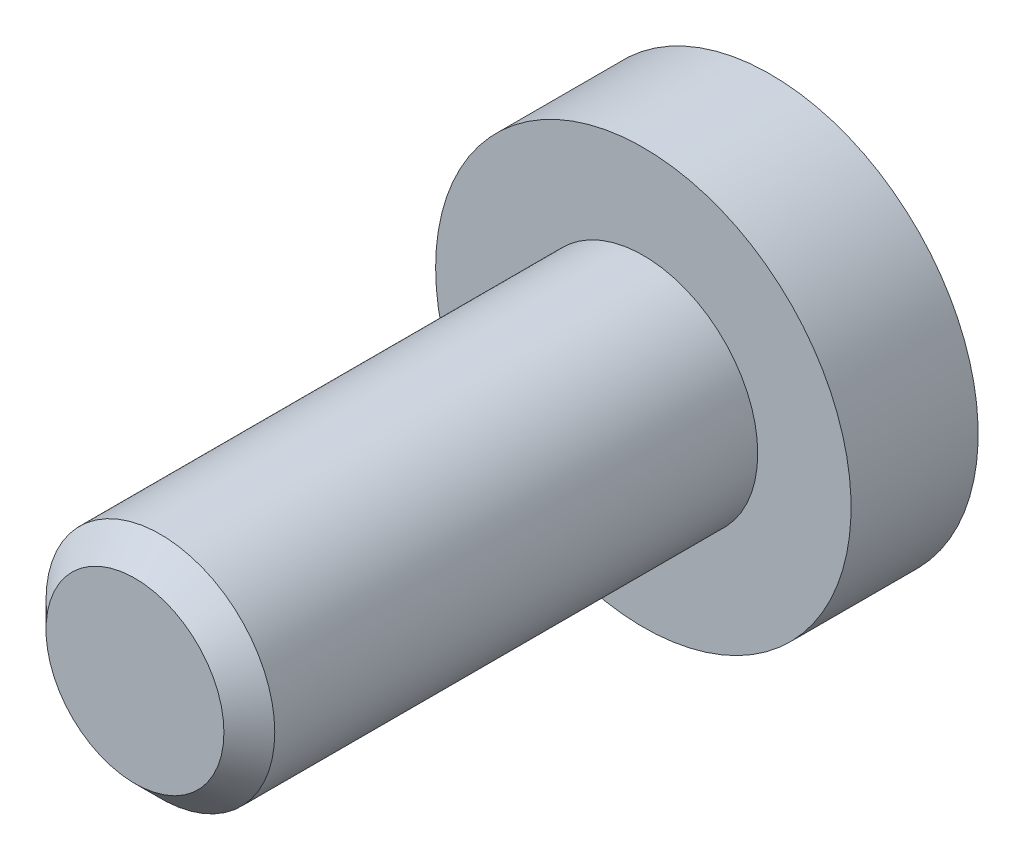
ISO-10303-21;
HEADER;
FILE_DESCRIPTION(('STEP AP214'),'2;1');
FILE_NAME('part.step','',(''),(''),'','','');
FILE_SCHEMA(('AUTOMOTIVE_DESIGN { 1 0 10303 214 1 1 1 1 }'));
ENDSEC;
DATA;
#1=APPLICATION_CONTEXT('core data for automotive mechanical design processes');
#2=APPLICATION_PROTOCOL_DEFINITION('international standard','automotive_design',2000,#1);
#3=PRODUCT_CONTEXT('',#1,'mechanical');
#4=PRODUCT('Part','Part','',(#3));
#5=PRODUCT_RELATED_PRODUCT_CATEGORY('part','',(#4));
#6=PRODUCT_DEFINITION_FORMATION('','',#4);
#7=PRODUCT_DEFINITION_CONTEXT('part definition',#1,'design');
#8=PRODUCT_DEFINITION('design','',#6,#7);
#9=PRODUCT_DEFINITION_SHAPE('','',#8);
#10=(LENGTH_UNIT() NAMED_UNIT(*) SI_UNIT(.MILLI.,.METRE.));
#11=(NAMED_UNIT(*) PLANE_ANGLE_UNIT() SI_UNIT($,.RADIAN.));
#12=(NAMED_UNIT(*) SI_UNIT($,.STERADIAN.) SOLID_ANGLE_UNIT());
#13=UNCERTAINTY_MEASURE_WITH_UNIT(LENGTH_MEASURE(1.E-05),#10,'distance_accuracy_value','');
#14=(GEOMETRIC_REPRESENTATION_CONTEXT(3) GLOBAL_UNCERTAINTY_ASSIGNED_CONTEXT((#13)) GLOBAL_UNIT_ASSIGNED_CONTEXT((#10,
#11,#12)) REPRESENTATION_CONTEXT('',''));
#15=CARTESIAN_POINT('',(0.,0.,0.));
#16=DIRECTION('',(0.,0.,1.));
#17=DIRECTION('',(1.,0.,0.));
#18=AXIS2_PLACEMENT_3D('',#15,#16,#17);
#19=CARTESIAN_POINT('',(0.,0.,10.));
#20=DIRECTION('',(0.,0.,-1.));
#21=DIRECTION('',(-1.,0.,0.));
#22=AXIS2_PLACEMENT_3D('',#19,#20,#21);
#23=PLANE('',#22);
#24=CARTESIAN_POINT('',(0.,0.,10.));
#25=DIRECTION('',(0.,0.,-1.));
#26=DIRECTION('',(-1.,0.,0.));
#27=AXIS2_PLACEMENT_3D('',#24,#25,#26);
#28=CIRCLE('',#27,16.3440730834026);
#29=CARTESIAN_POINT('',(-16.3440730834026,0.,10.));
#30=VERTEX_POINT('',#29);
#31=EDGE_CURVE('E46',#30,#30,#28,.T.);
#32=ORIENTED_EDGE('',*,*,#31,.F.);
#33=EDGE_LOOP('',(#32));
#34=FACE_BOUND('',#33,.T.);
#35=CARTESIAN_POINT('',(0.,0.,10.));
#36=DIRECTION('',(0.,0.,-1.));
#37=DIRECTION('',(-1.,0.,0.));
#38=AXIS2_PLACEMENT_3D('',#35,#36,#37);
#39=CIRCLE('',#38,9.);
#40=CARTESIAN_POINT('',(9.,0.,10.));
#41=VERTEX_POINT('',#40);
#42=EDGE_CURVE('E55',#41,#41,#39,.F.);
#43=ORIENTED_EDGE('',*,*,#42,.F.);
#44=EDGE_LOOP('',(#43));
#45=FACE_BOUND('',#44,.T.);
#46=ADVANCED_FACE('F38',(#34,#45),#23,.F.);
#47=CARTESIAN_POINT('',(0.,0.,10.));
#48=DIRECTION('',(0.,0.,-1.));
#49=DIRECTION('',(-1.,0.,0.));
#50=AXIS2_PLACEMENT_3D('',#47,#48,#49);
#51=CYLINDRICAL_SURFACE('',#50,16.3440730834026);
#52=ORIENTED_EDGE('',*,*,#31,.T.);
#53=EDGE_LOOP('',(#52));
#54=FACE_BOUND('',#53,.T.);
#55=CARTESIAN_POINT('',(0.,0.,0.));
#56=DIRECTION('',(0.,0.,-1.));
#57=DIRECTION('',(-1.,0.,0.));
#58=AXIS2_PLACEMENT_3D('',#55,#56,#57);
#59=CIRCLE('',#58,16.3440730834026);
#60=CARTESIAN_POINT('',(-16.3440730834026,0.,0.));
#61=VERTEX_POINT('',#60);
#62=EDGE_CURVE('E50',#61,#61,#59,.T.);
#63=ORIENTED_EDGE('',*,*,#62,.F.);
#64=EDGE_LOOP('',(#63));
#65=FACE_BOUND('',#64,.T.);
#66=ADVANCED_FACE('F73',(#54,#65),#51,.T.);
#67=CARTESIAN_POINT('',(0.,0.,0.));
#68=DIRECTION('',(0.,0.,1.));
#69=DIRECTION('',(1.,0.,0.));
#70=AXIS2_PLACEMENT_3D('',#67,#68,#69);
#71=PLANE('',#70);
#72=ORIENTED_EDGE('',*,*,#62,.T.);
#73=EDGE_LOOP('',(#72));
#74=FACE_BOUND('',#73,.T.);
#75=ADVANCED_FACE('F66',(#74),#71,.F.);
#76=CARTESIAN_POINT('',(0.,0.,-36.6902998343092));
#77=DIRECTION('',(0.,0.,1.));
#78=DIRECTION('',(1.,0.,0.));
#79=AXIS2_PLACEMENT_3D('',#76,#77,#78);
#80=CYLINDRICAL_SURFACE('',#79,9.);
#81=CARTESIAN_POINT('',(0.,0.,48.));
#82=DIRECTION('',(0.,0.,-1.));
#83=DIRECTION('',(-1.,0.,0.));
#84=AXIS2_PLACEMENT_3D('',#81,#82,#83);
#85=CIRCLE('',#84,9.);
#86=CARTESIAN_POINT('',(9.,0.,48.));
#87=VERTEX_POINT('',#86);
#88=EDGE_CURVE('E42',#87,#87,#85,.F.);
#89=CARTESIAN_POINT('',(9.,0.,48.));
#90=CARTESIAN_POINT('',(9.,0.,47.6041666666667));
#91=CARTESIAN_POINT('',(9.,0.,47.2083333333333));
#92=CARTESIAN_POINT('',(9.,0.,46.4166666666667));
#93=CARTESIAN_POINT('',(9.,0.,46.0208333333333));
#94=CARTESIAN_POINT('',(9.,0.,45.2291666666667));
#95=CARTESIAN_POINT('',(9.,0.,44.8333333333333));
#96=CARTESIAN_POINT('',(9.,0.,44.0416666666667));
#97=CARTESIAN_POINT('',(9.,0.,43.6458333333333));
#98=CARTESIAN_POINT('',(9.,0.,42.8541666666667));
#99=CARTESIAN_POINT('',(9.,0.,42.4583333333333));
#100=CARTESIAN_POINT('',(9.,0.,41.6666666666667));
#101=CARTESIAN_POINT('',(9.,0.,41.2708333333333));
#102=CARTESIAN_POINT('',(9.,0.,40.4791666666667));
#103=CARTESIAN_POINT('',(9.,0.,40.0833333333333));
#104=CARTESIAN_POINT('',(9.,0.,39.2916666666667));
#105=CARTESIAN_POINT('',(9.,0.,38.8958333333333));
#106=CARTESIAN_POINT('',(9.,0.,38.1041666666667));
#107=CARTESIAN_POINT('',(9.,0.,37.7083333333333));
#108=CARTESIAN_POINT('',(9.,0.,36.9166666666667));
#109=CARTESIAN_POINT('',(9.,0.,36.5208333333333));
#110=CARTESIAN_POINT('',(9.,0.,35.7291666666667));
#111=CARTESIAN_POINT('',(9.,0.,35.3333333333333));
#112=CARTESIAN_POINT('',(9.,0.,34.5416666666667));
#113=CARTESIAN_POINT('',(9.,0.,34.1458333333333));
#114=CARTESIAN_POINT('',(9.,0.,33.3541666666667));
#115=CARTESIAN_POINT('',(9.,0.,32.9583333333333));
#116=CARTESIAN_POINT('',(9.,0.,32.1666666666667));
#117=CARTESIAN_POINT('',(9.,0.,31.7708333333333));
#118=CARTESIAN_POINT('',(9.,0.,30.9791666666667));
#119=CARTESIAN_POINT('',(9.,0.,30.5833333333333));
#120=CARTESIAN_POINT('',(9.,0.,29.7916666666667));
#121=CARTESIAN_POINT('',(9.,0.,29.3958333333333));
#122=CARTESIAN_POINT('',(9.,0.,28.6041666666667));
#123=CARTESIAN_POINT('',(9.,0.,28.2083333333333));
#124=CARTESIAN_POINT('',(9.,0.,27.4166666666667));
#125=CARTESIAN_POINT('',(9.,0.,27.0208333333333));
#126=CARTESIAN_POINT('',(9.,0.,26.2291666666667));
#127=CARTESIAN_POINT('',(9.,0.,25.8333333333333));
#128=CARTESIAN_POINT('',(9.,0.,25.0416666666667));
#129=CARTESIAN_POINT('',(9.,0.,24.6458333333333));
#130=CARTESIAN_POINT('',(9.,0.,23.8541666666667));
#131=CARTESIAN_POINT('',(9.,0.,23.4583333333333));
#132=CARTESIAN_POINT('',(9.,0.,22.6666666666667));
#133=CARTESIAN_POINT('',(9.,0.,22.2708333333333));
#134=CARTESIAN_POINT('',(9.,0.,21.4791666666667));
#135=CARTESIAN_POINT('',(9.,0.,21.0833333333333));
#136=CARTESIAN_POINT('',(9.,0.,20.2916666666667));
#137=CARTESIAN_POINT('',(9.,0.,19.8958333333333));
#138=CARTESIAN_POINT('',(9.,0.,19.1041666666667));
#139=CARTESIAN_POINT('',(9.,0.,18.7083333333333));
#140=CARTESIAN_POINT('',(9.,0.,17.9166666666667));
#141=CARTESIAN_POINT('',(9.,0.,17.5208333333333));
#142=CARTESIAN_POINT('',(9.,0.,16.7291666666667));
#143=CARTESIAN_POINT('',(9.,0.,16.3333333333333));
#144=CARTESIAN_POINT('',(9.,0.,15.5416666666667));
#145=CARTESIAN_POINT('',(9.,0.,15.1458333333333));
#146=CARTESIAN_POINT('',(9.,0.,14.3541666666667));
#147=CARTESIAN_POINT('',(9.,0.,13.9583333333333));
#148=CARTESIAN_POINT('',(9.,0.,13.1666666666667));
#149=CARTESIAN_POINT('',(9.,0.,12.7708333333333));
#150=CARTESIAN_POINT('',(9.,0.,11.9791666666667));
#151=CARTESIAN_POINT('',(9.,0.,11.5833333333333));
#152=CARTESIAN_POINT('',(9.,0.,10.7916666666667));
#153=CARTESIAN_POINT('',(9.,0.,10.3958333333333));
#154=CARTESIAN_POINT('',(9.,0.,10.));
#155=B_SPLINE_CURVE_WITH_KNOTS('',3,(#89,#90,#91,#92,#93,#94,#95,#96,#97,#98,#99,#100,#101,#102,
#103,#104,#105,#106,#107,#108,#109,#110,#111,#112,#113,#114,#115,#116,#117,#118,#119,#120,#121,
#122,#123,#124,#125,#126,#127,#128,#129,#130,#131,#132,#133,#134,#135,#136,#137,#138,#139,#140,
#141,#142,#143,#144,#145,#146,#147,#148,#149,#150,#151,#152,#153,#154),.UNSPECIFIED.,.F.,.F.,(4,
2,2,2,2,2,2,2,2,2,2,2,2,2,2,2,2,2,2,2,2,2,2,2,2,2,2,2,2,2,2,2,4),(0.,1.18749999999999,2.375,
3.5625,4.75,5.9375,7.12500000000001,8.3125,9.50000000000001,10.6875,11.875,13.0625,14.25,
15.4375,16.625,17.8125,19.,20.1875,21.375,22.5625,23.75,24.9375,26.125,27.3125,28.5,29.6875,
30.875,32.0625,33.25,34.4375,35.625,36.8125,38.),.UNSPECIFIED.);
#156=EDGE_CURVE('BSEAM63',#87,#41,#155,.T.);
#157=ORIENTED_EDGE('',*,*,#88,.F.);
#158=ORIENTED_EDGE('',*,*,#42,.T.);
#159=ORIENTED_EDGE('',*,*,#156,.T.);
#160=ORIENTED_EDGE('',*,*,#156,.F.);
#161=EDGE_LOOP('',(#157,#159,#158,#160));
#162=FACE_BOUND('',#161,.T.);
#163=ADVANCED_FACE('F63',(#162),#80,.T.);
#164=CARTESIAN_POINT('',(0.,0.,50.));
#165=DIRECTION('',(0.,0.,1.));
#166=DIRECTION('',(1.,0.,0.));
#167=AXIS2_PLACEMENT_3D('',#164,#165,#166);
#168=PLANE('',#167);
#169=CARTESIAN_POINT('',(0.,0.,50.));
#170=DIRECTION('',(0.,0.,1.));
#171=DIRECTION('',(1.,0.,0.));
#172=AXIS2_PLACEMENT_3D('',#169,#170,#171);
#173=CIRCLE('',#172,6.99999999999999);
#174=CARTESIAN_POINT('',(6.99999999999999,0.,50.));
#175=VERTEX_POINT('',#174);
#176=EDGE_CURVE('E11',#175,#175,#173,.T.);
#177=ORIENTED_EDGE('',*,*,#176,.T.);
#178=EDGE_LOOP('',(#177));
#179=FACE_BOUND('',#178,.T.);
#180=ADVANCED_FACE('F65',(#179),#168,.T.);
#181=CARTESIAN_POINT('',(0.,0.,50.));
#182=DIRECTION('',(0.,0.,-1.));
#183=DIRECTION('',(-1.,0.,0.));
#184=AXIS2_PLACEMENT_3D('',#181,#182,#183);
#185=CONICAL_SURFACE('',#184,6.99999999999999,0.785398163397447);
#186=ORIENTED_EDGE('',*,*,#176,.F.);
#187=EDGE_LOOP('',(#186));
#188=FACE_BOUND('',#187,.T.);
#189=ORIENTED_EDGE('',*,*,#88,.T.);
#190=EDGE_LOOP('',(#189));
#191=FACE_BOUND('',#190,.T.);
#192=ADVANCED_FACE('F40',(#188,#191),#185,.T.);
#193=CLOSED_SHELL('',(#46,#66,#75,#163,#180,#192));
#194=MANIFOLD_SOLID_BREP('B2',#193);
#195=ADVANCED_BREP_SHAPE_REPRESENTATION('',(#18,#194),#14);
#196=SHAPE_DEFINITION_REPRESENTATION(#9,#195);
ENDSEC;
END-ISO-10303-21;
